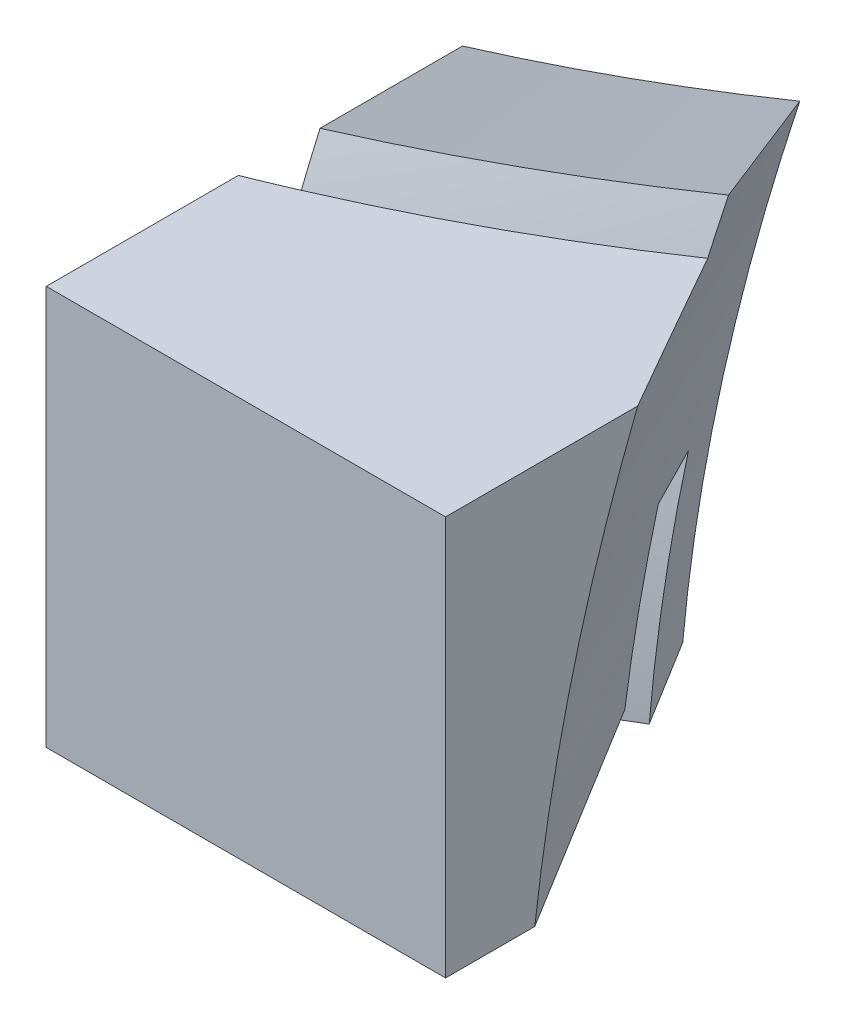
ISO-10303-21;
HEADER;
FILE_DESCRIPTION(('STEP AP214'),'2;1');
FILE_NAME('part.step','',(''),(''),'','','');
FILE_SCHEMA(('AUTOMOTIVE_DESIGN { 1 0 10303 214 1 1 1 1 }'));
ENDSEC;
DATA;
#1=APPLICATION_CONTEXT('core data for automotive mechanical design processes');
#2=APPLICATION_PROTOCOL_DEFINITION('international standard','automotive_design',2000,#1);
#3=PRODUCT_CONTEXT('',#1,'mechanical');
#4=PRODUCT('Part','Part','',(#3));
#5=PRODUCT_RELATED_PRODUCT_CATEGORY('part','',(#4));
#6=PRODUCT_DEFINITION_FORMATION('','',#4);
#7=PRODUCT_DEFINITION_CONTEXT('part definition',#1,'design');
#8=PRODUCT_DEFINITION('design','',#6,#7);
#9=PRODUCT_DEFINITION_SHAPE('','',#8);
#10=(LENGTH_UNIT() NAMED_UNIT(*) SI_UNIT(.MILLI.,.METRE.));
#11=(NAMED_UNIT(*) PLANE_ANGLE_UNIT() SI_UNIT($,.RADIAN.));
#12=(NAMED_UNIT(*) SI_UNIT($,.STERADIAN.) SOLID_ANGLE_UNIT());
#13=UNCERTAINTY_MEASURE_WITH_UNIT(LENGTH_MEASURE(1.E-05),#10,'distance_accuracy_value','');
#14=(GEOMETRIC_REPRESENTATION_CONTEXT(3) GLOBAL_UNCERTAINTY_ASSIGNED_CONTEXT((#13)) GLOBAL_UNIT_ASSIGNED_CONTEXT((#10,
#11,#12)) REPRESENTATION_CONTEXT('',''));
#15=CARTESIAN_POINT('',(0.,0.,0.));
#16=DIRECTION('',(0.,0.,1.));
#17=DIRECTION('',(1.,0.,0.));
#18=AXIS2_PLACEMENT_3D('',#15,#16,#17);
#19=CARTESIAN_POINT('',(19.4999999999999,32.5,0.));
#20=DIRECTION('',(-1.,0.,0.));
#21=DIRECTION('',(0.,0.,-1.));
#22=AXIS2_PLACEMENT_3D('',#19,#20,#21);
#23=PLANE('',#22);
#24=DIRECTION('',(0.,0.,-1.));
#25=VECTOR('',#24,1.);
#26=CARTESIAN_POINT('',(19.5,3.90000000000005,0.));
#27=LINE('',#26,#25);
#28=CARTESIAN_POINT('',(19.5,3.90000000000005,33.));
#29=VERTEX_POINT('',#28);
#30=CARTESIAN_POINT('',(19.5,3.90000000000005,31.2576390663146));
#31=VERTEX_POINT('',#30);
#32=EDGE_CURVE('E108',#29,#31,#27,.T.);
#33=ORIENTED_EDGE('',*,*,#32,.T.);
#34=CARTESIAN_POINT('',(19.5,0.,0.));
#35=DIRECTION('',(1.,0.,0.));
#36=DIRECTION('',(0.,0.,-1.));
#37=AXIS2_PLACEMENT_3D('',#34,#35,#36);
#38=CIRCLE('',#37,31.4999999999999);
#39=CARTESIAN_POINT('',(19.5,11.7000000000001,29.2465382566894));
#40=VERTEX_POINT('',#39);
#41=EDGE_CURVE('E45',#40,#31,#38,.T.);
#42=ORIENTED_EDGE('',*,*,#41,.F.);
#43=DIRECTION('',(0.,0.,-1.));
#44=VECTOR('',#43,1.);
#45=CARTESIAN_POINT('',(19.5,11.7000000000001,0.));
#46=LINE('',#45,#44);
#47=CARTESIAN_POINT('',(19.5,11.7,33.));
#48=VERTEX_POINT('',#47);
#49=EDGE_CURVE('E204',#48,#40,#46,.T.);
#50=ORIENTED_EDGE('',*,*,#49,.F.);
#51=DIRECTION('',(0.,1.,0.));
#52=VECTOR('',#51,1.);
#53=CARTESIAN_POINT('',(19.5000000000001,0.,33.));
#54=LINE('',#53,#52);
#55=EDGE_CURVE('E279',#29,#48,#54,.T.);
#56=ORIENTED_EDGE('',*,*,#55,.F.);
#57=EDGE_LOOP('',(#33,#42,#50,#56));
#58=FACE_BOUND('',#57,.T.);
#59=ADVANCED_FACE('F41',(#58),#23,.F.);
#60=CARTESIAN_POINT('',(13.5486364278669,0.,0.));
#61=DIRECTION('',(1.,0.,0.));
#62=DIRECTION('',(0.,0.,1.));
#63=AXIS2_PLACEMENT_3D('',#60,#61,#62);
#64=CONICAL_SURFACE('',#63,21.8862588450156,1.01648883059334);
#65=CARTESIAN_POINT('',(24.8011031541808,2.36043317420627,39.9937245464798));
#66=CARTESIAN_POINT('',(24.0512747995102,2.36043317420627,38.7803446115436));
#67=CARTESIAN_POINT('',(23.3015229149317,2.36043317420627,37.5669173991451));
#68=CARTESIAN_POINT('',(21.8022498437714,2.36043317420627,35.1399211144635));
#69=CARTESIAN_POINT('',(21.0527286571003,2.36043317420627,33.9263520422357));
#70=CARTESIAN_POINT('',(19.5539961645206,2.36043317420627,31.4990270418376));
#71=CARTESIAN_POINT('',(18.8047848577878,2.36043317420627,30.2852711141763));
#72=CARTESIAN_POINT('',(17.3068000141458,2.36043317420627,27.857488409065));
#73=CARTESIAN_POINT('',(16.5580264774201,2.36043317420627,26.6434616315017));
#74=CARTESIAN_POINT('',(15.0611285097934,2.36043317420627,24.2150008856621));
#75=CARTESIAN_POINT('',(14.3130040816391,2.36043317420627,23.0005669156926));
#76=CARTESIAN_POINT('',(12.8177734965329,2.36043317420627,20.5710735887598));
#77=CARTESIAN_POINT('',(12.0706673385902,2.36043317420627,19.3560142324065));
#78=CARTESIAN_POINT('',(10.951334575524,2.36043317420627,17.5326073416469));
#79=CARTESIAN_POINT('',(10.578443967322,2.36043317420627,16.9246674831929));
#80=CARTESIAN_POINT('',(9.83327851220865,2.36043317420627,15.7084108964553));
#81=CARTESIAN_POINT('',(9.46100366496131,2.36043317420627,15.1000941683775));
#82=CARTESIAN_POINT('',(8.71731898611144,2.36043317420627,13.8829290094769));
#83=CARTESIAN_POINT('',(8.34590915748662,2.36043317420627,13.2740805768336));
#84=CARTESIAN_POINT('',(7.78976255798648,2.36043317420627,12.3602178829223));
#85=CARTESIAN_POINT('',(7.60454154550687,2.36043317420627,12.0554983636333));
#86=CARTESIAN_POINT('',(7.23450991285466,2.36043317420627,11.4458100205214));
#87=CARTESIAN_POINT('',(7.04969929293434,2.36043317420627,11.1408411965452));
#88=CARTESIAN_POINT('',(6.86513776470055,2.36043317420627,10.8357215029914));
#89=B_SPLINE_CURVE_WITH_KNOTS('',3,(#65,#66,#67,#68,#69,#70,#71,#72,#73,#74,#75,#76,#77,#78,#79,
#80,#81,#82,#83,#84,#85,#86,#87,#88),.UNSPECIFIED.,.F.,.F.,(4,2,2,2,2,2,2,2,2,2,2,4),(0.,
4.27911218230018,8.55822270549597,12.8373217708467,17.1164226271796,21.3955415022916,
25.6746562108054,27.8142223728062,29.9537873670591,32.0933597156334,33.163147857496,
34.2329366568243),.UNSPECIFIED.);
#90=CARTESIAN_POINT('',(15.654054886332,2.36043317420627,25.176911630983));
#91=VERTEX_POINT('',#90);
#92=CARTESIAN_POINT('',(14.6013456570994,2.36043317420627,23.4683824983539));
#93=VERTEX_POINT('',#92);
#94=EDGE_CURVE('E154',#91,#93,#89,.T.);
#95=ORIENTED_EDGE('',*,*,#94,.T.);
#96=CARTESIAN_POINT('',(14.6013456570995,0.,0.));
#97=DIRECTION('',(-1.,0.,0.));
#98=DIRECTION('',(0.,-1.,0.));
#99=AXIS2_PLACEMENT_3D('',#96,#97,#98);
#100=CIRCLE('',#99,23.5867891383913);
#101=CARTESIAN_POINT('',(14.6013456570994,10.3743688599618,21.1827546040733));
#102=VERTEX_POINT('',#101);
#103=EDGE_CURVE('E217',#102,#93,#100,.F.);
#104=ORIENTED_EDGE('',*,*,#103,.F.);
#105=DIRECTION('',(0.526354614616296,0.373979018880187,0.763603636129074));
#106=VECTOR('',#105,1.);
#107=CARTESIAN_POINT('',(0.,0.,0.));
#108=LINE('',#107,#106);
#109=CARTESIAN_POINT('',(17.6869248733467,12.5666967239637,25.6591274592982));
#110=VERTEX_POINT('',#109);
#111=EDGE_CURVE('E292',#110,#102,#108,.F.);
#112=ORIENTED_EDGE('',*,*,#111,.F.);
#113=CARTESIAN_POINT('',(17.6869248733468,0.,0.));
#114=DIRECTION('',(-1.,0.,0.));
#115=DIRECTION('',(0.,-1.,0.));
#116=AXIS2_PLACEMENT_3D('',#113,#114,#115);
#117=CIRCLE('',#116,28.5711863338677);
#118=CARTESIAN_POINT('',(17.6869248733467,11.7000000000001,26.0657378281258));
#119=VERTEX_POINT('',#118);
#120=EDGE_CURVE('E296',#119,#110,#117,.T.);
#121=ORIENTED_EDGE('',*,*,#120,.F.);
#122=CARTESIAN_POINT('',(29.9831042332942,11.7000000000001,46.9998523165172));
#123=CARTESIAN_POINT('',(29.5695460419096,11.7000000000001,46.3114035057555));
#124=CARTESIAN_POINT('',(29.1563727624076,11.7000000000001,45.6227235286328));
#125=CARTESIAN_POINT('',(28.3309145968263,11.7000000000001,44.2448305512274));
#126=CARTESIAN_POINT('',(27.9186297115495,11.7000000000001,43.555617550464));
#127=CARTESIAN_POINT('',(26.6832428349779,11.7000000000001,41.4870015235794));
#128=CARTESIAN_POINT('',(25.8616526236678,11.7000000000001,40.1066946636882));
#129=CARTESIAN_POINT('',(24.2230959746683,11.7000000000001,37.3416252164109));
#130=CARTESIAN_POINT('',(23.4061344741696,11.7000000000001,35.9568597018244));
#131=CARTESIAN_POINT('',(21.7796223492399,11.7000000000001,33.1830492762636));
#132=CARTESIAN_POINT('',(20.970071426122,11.7000000000001,31.7940045408084));
#133=CARTESIAN_POINT('',(19.7705932500849,11.7000000000001,29.7178208854183));
#134=CARTESIAN_POINT('',(19.3766538702403,11.7000000000001,29.0330001316483));
#135=CARTESIAN_POINT('',(18.5918894504467,11.7000000000001,27.6615773365093));
#136=CARTESIAN_POINT('',(18.2010644029119,11.7000000000001,26.9749752994846));
#137=CARTESIAN_POINT('',(17.423168342795,11.7000000000001,25.5995290510725));
#138=CARTESIAN_POINT('',(17.036097821589,11.7000000000001,24.9106845615479));
#139=CARTESIAN_POINT('',(16.2666803040386,11.7000000000001,23.5303641361797));
#140=CARTESIAN_POINT('',(15.8843332831974,11.7000000000001,22.8388882140075));
#141=CARTESIAN_POINT('',(15.1254733333848,11.7000000000001,21.4524772962229));
#142=CARTESIAN_POINT('',(14.7489621260672,11.7000000000001,20.7575413568386));
#143=CARTESIAN_POINT('',(14.0035422153921,11.7000000000001,19.3635718196275));
#144=CARTESIAN_POINT('',(13.6346337030667,11.7000000000001,18.6645381194022));
#145=CARTESIAN_POINT('',(12.9068241377435,11.7000000000001,17.2614510623169));
#146=CARTESIAN_POINT('',(12.5479210327491,11.7000000000001,16.5573987724639));
#147=CARTESIAN_POINT('',(11.8433270003428,11.7000000000001,15.1427313714644));
#148=CARTESIAN_POINT('',(11.497635196273,11.7000000000001,14.4321166996746));
#149=CARTESIAN_POINT('',(10.9364574878759,11.7000000000001,13.240600979307));
#150=CARTESIAN_POINT('',(10.7159690889732,11.7000000000001,12.7620597933423));
#151=CARTESIAN_POINT('',(10.2849806158187,11.7000000000001,11.8004978032896));
#152=CARTESIAN_POINT('',(10.0744802539218,11.7000000000001,11.3174771286857));
#153=CARTESIAN_POINT('',(9.66645541430141,11.7000000000001,10.3472711456755));
#154=CARTESIAN_POINT('',(9.4689021222929,11.7000000000001,9.86009801543928));
#155=CARTESIAN_POINT('',(9.08946560082895,11.7000000000001,8.87955373046023));
#156=CARTESIAN_POINT('',(8.90758483272758,11.7000000000001,8.3861816160635));
#157=CARTESIAN_POINT('',(8.5624843162843,11.7000000000001,7.38905623057931));
#158=CARTESIAN_POINT('',(8.39940314340287,11.7000000000001,6.88525462559466));
#159=CARTESIAN_POINT('',(8.09868484115985,11.7000000000001,5.87024913974239));
#160=CARTESIAN_POINT('',(7.96103480095306,11.7000000000001,5.35904915780938));
#161=CARTESIAN_POINT('',(7.77767829893197,11.7000000000001,4.58476199325067));
#162=CARTESIAN_POINT('',(7.720241995675,11.7000000000001,4.32443264170045));
#163=CARTESIAN_POINT('',(7.61414186909903,11.7000000000001,3.80199727296307));
#164=CARTESIAN_POINT('',(7.5654774514676,11.7000000000001,3.53989137738966));
#165=CARTESIAN_POINT('',(7.47762859472269,11.7000000000001,3.01369854516661));
#166=CARTESIAN_POINT('',(7.43845788058526,11.7000000000001,2.74960930277732));
#167=CARTESIAN_POINT('',(7.37033995165896,11.7000000000001,2.22004865762173));
#168=CARTESIAN_POINT('',(7.34139544112448,11.7000000000001,1.95457690806531));
#169=CARTESIAN_POINT('',(7.31790114012981,11.7000000000001,1.68859662969376));
#170=B_SPLINE_CURVE_WITH_KNOTS('',3,(#122,#123,#124,#125,#126,#127,#128,#129,#130,#131,#132,
#133,#134,#135,#136,#137,#138,#139,#140,#141,#142,#143,#144,#145,#146,#147,#148,#149,#150,#151,
#152,#153,#154,#155,#156,#157,#158,#159,#160,#161,#162,#163,#164,#165,#166,#167,#168,#169),
.UNSPECIFIED.,.F.,.F.,(4,2,2,2,2,2,2,2,2,2,2,2,2,2,2,2,2,2,2,2,2,2,2,4),(0.,2.40934177011957,
4.81868571602445,9.63762980352724,14.4609978331241,19.2841705909017,21.6542928680232,
24.0244093702654,26.3948319875908,28.7652423064302,31.1363391094846,33.5074954184083,
35.8781617978656,38.2486705936817,39.8292635557093,41.4098109706272,42.9867121606657,
44.5638605517928,46.1519772751732,47.7392855165716,48.5389310863669,49.3385224582279,
50.1392629888806,50.9402151120507),.UNSPECIFIED.);
#171=EDGE_CURVE('E197',#40,#119,#170,.T.);
#172=ORIENTED_EDGE('',*,*,#171,.F.);
#173=ORIENTED_EDGE('',*,*,#41,.T.);
#174=CARTESIAN_POINT('',(26.981632298887,3.90000000000005,43.410879280691));
#175=CARTESIAN_POINT('',(26.1079588700875,3.90000000000005,41.9938382880044));
#176=CARTESIAN_POINT('',(25.2345013435676,3.90000000000005,40.576663996944));
#177=CARTESIAN_POINT('',(23.4882737650834,3.90000000000005,37.7419020872876));
#178=CARTESIAN_POINT('',(22.6155037095799,3.90000000000005,36.3243144708717));
#179=CARTESIAN_POINT('',(20.8709210600193,3.90000000000005,33.4886024943368));
#180=CARTESIAN_POINT('',(19.9991084409297,3.90000000000005,32.0704781496204));
#181=CARTESIAN_POINT('',(18.256847910122,3.90000000000005,29.2333806526732));
#182=CARTESIAN_POINT('',(17.3864000056548,3.90000000000005,27.8144074959875));
#183=CARTESIAN_POINT('',(16.0823163404525,3.90000000000005,25.6849295437214));
#184=CARTESIAN_POINT('',(15.647876369202,3.90000000000005,24.974917283884));
#185=CARTESIAN_POINT('',(14.7796918509744,3.90000000000005,23.5544684540386));
#186=CARTESIAN_POINT('',(14.3459473034086,3.90000000000005,22.8440318843905));
#187=CARTESIAN_POINT('',(13.4793719578897,3.90000000000005,21.422614494192));
#188=CARTESIAN_POINT('',(13.0465411478755,3.90000000000005,20.7116336809963));
#189=CARTESIAN_POINT('',(12.182098353347,3.90000000000005,19.2889280552639));
#190=CARTESIAN_POINT('',(11.7504863726865,3.90000000000005,18.5772032403845));
#191=CARTESIAN_POINT('',(10.8889370785867,3.90000000000005,17.1526941527402));
#192=CARTESIAN_POINT('',(10.4589998457121,3.90000000000005,16.4399098312314));
#193=CARTESIAN_POINT('',(9.60156393048008,3.90000000000005,15.0128821247618));
#194=CARTESIAN_POINT('',(9.17406522692966,3.90000000000005,14.2986387525548));
#195=CARTESIAN_POINT('',(8.53560197710837,3.90000000000005,13.2255923954237));
#196=CARTESIAN_POINT('',(8.32323983628905,3.90000000000005,12.8676212298307));
#197=CARTESIAN_POINT('',(7.8997080584052,3.90000000000005,12.1509755139606));
#198=CARTESIAN_POINT('',(7.68853841724979,3.90000000000005,11.792300966102));
#199=CARTESIAN_POINT('',(7.26770931672158,3.90000000000005,11.0740513729932));
#200=CARTESIAN_POINT('',(7.05804990234182,3.90000000000005,10.714476301341));
#201=CARTESIAN_POINT('',(6.64077224921907,3.90000000000005,9.99413869080626));
#202=CARTESIAN_POINT('',(6.43315403474698,3.90000000000005,9.63337613787198));
#203=CARTESIAN_POINT('',(6.22682125004522,3.90000000000005,9.27187532338227));
#204=B_SPLINE_CURVE_WITH_KNOTS('',3,(#174,#175,#176,#177,#178,#179,#180,#181,#182,#183,#184,
#185,#186,#187,#188,#189,#190,#191,#192,#193,#194,#195,#196,#197,#198,#199,#200,#201,#202,#203),
.UNSPECIFIED.,.F.,.F.,(4,2,2,2,2,2,2,2,2,2,2,2,2,2,4),(0.,4.9941762265666,9.98832657213658,
14.9823430770962,19.9763860263468,22.4735239949208,24.9706598486392,27.4677625324719,
29.9648731031794,32.4621023511511,34.9593098629344,36.2079750776802,37.4566360062806,
38.7053339826941,39.9540467888454),.UNSPECIFIED.);
#205=CARTESIAN_POINT('',(16.7067641155646,3.90000000000005,26.7045695113568));
#206=VERTEX_POINT('',#205);
#207=EDGE_CURVE('E211',#31,#206,#204,.T.);
#208=ORIENTED_EDGE('',*,*,#207,.T.);
#209=CARTESIAN_POINT('',(16.7067641155646,0.,0.));
#210=DIRECTION('',(-1.,0.,0.));
#211=DIRECTION('',(0.,-1.,0.));
#212=AXIS2_PLACEMENT_3D('',#209,#210,#211);
#213=CIRCLE('',#212,26.9878497251428);
#214=CARTESIAN_POINT('',(16.7067641155646,7.04704306544776,26.0515492211234));
#215=VERTEX_POINT('',#214);
#216=EDGE_CURVE('E93',#206,#215,#213,.T.);
#217=ORIENTED_EDGE('',*,*,#216,.T.);
#218=DIRECTION('',(0.526354614616296,0.222020470944612,0.820766550337953));
#219=VECTOR('',#218,1.);
#220=CARTESIAN_POINT('',(0.,0.,0.));
#221=LINE('',#220,#219);
#222=CARTESIAN_POINT('',(15.654054886332,6.60300212355853,24.4100161204475));
#223=VERTEX_POINT('',#222);
#224=EDGE_CURVE('E115',#215,#223,#221,.F.);
#225=ORIENTED_EDGE('',*,*,#224,.T.);
#226=CARTESIAN_POINT('',(15.654054886332,0.,0.));
#227=DIRECTION('',(-1.,0.,0.));
#228=DIRECTION('',(0.,-1.,0.));
#229=AXIS2_PLACEMENT_3D('',#226,#227,#228);
#230=CIRCLE('',#229,25.287319431767);
#231=EDGE_CURVE('E311',#223,#91,#230,.F.);
#232=ORIENTED_EDGE('',*,*,#231,.T.);
#233=EDGE_LOOP('',(#95,#104,#112,#121,#172,#173,#208,#217,#225,#232));
#234=FACE_BOUND('',#233,.T.);
#235=ADVANCED_FACE('F177',(#234),#64,.F.);
#236=CARTESIAN_POINT('',(32.5,11.7000000000001,0.));
#237=DIRECTION('',(0.,-1.,0.));
#238=DIRECTION('',(0.,0.,-1.));
#239=AXIS2_PLACEMENT_3D('',#236,#237,#238);
#240=PLANE('',#239);
#241=ORIENTED_EDGE('',*,*,#49,.T.);
#242=ORIENTED_EDGE('',*,*,#171,.T.);
#243=CARTESIAN_POINT('',(0.,11.7000000000001,0.));
#244=DIRECTION('',(0.,-1.,0.));
#245=DIRECTION('',(0.,0.,-1.));
#246=AXIS2_PLACEMENT_3D('',#243,#244,#245);
#247=CIRCLE('',#246,31.5);
#248=CARTESIAN_POINT('',(12.5666967239636,11.7000000000001,28.8847387637126));
#249=VERTEX_POINT('',#248);
#250=EDGE_CURVE('E222',#119,#249,#247,.T.);
#251=ORIENTED_EDGE('',*,*,#250,.T.);
#252=CARTESIAN_POINT('',(11.7,11.7000000000001,29.2465382566895));
#253=VERTEX_POINT('',#252);
#254=EDGE_CURVE('E224',#249,#253,#247,.T.);
#255=ORIENTED_EDGE('',*,*,#254,.T.);
#256=DIRECTION('',(0.,0.,-1.));
#257=VECTOR('',#256,1.);
#258=CARTESIAN_POINT('',(11.7,11.7000000000001,0.));
#259=LINE('',#258,#257);
#260=CARTESIAN_POINT('',(11.7,11.7000000000001,33.));
#261=VERTEX_POINT('',#260);
#262=EDGE_CURVE('E283',#261,#253,#259,.T.);
#263=ORIENTED_EDGE('',*,*,#262,.F.);
#264=DIRECTION('',(-1.,0.,0.));
#265=VECTOR('',#264,1.);
#266=CARTESIAN_POINT('',(0.,11.7000000000001,33.));
#267=LINE('',#266,#265);
#268=EDGE_CURVE('E277',#48,#261,#267,.T.);
#269=ORIENTED_EDGE('',*,*,#268,.F.);
#270=EDGE_LOOP('',(#241,#242,#251,#255,#263,#269));
#271=FACE_BOUND('',#270,.T.);
#272=ADVANCED_FACE('F183',(#271),#240,.F.);
#273=CARTESIAN_POINT('',(0.,0.,0.));
#274=DIRECTION('',(0.,-1.,0.));
#275=DIRECTION('',(1.,0.,0.));
#276=AXIS2_PLACEMENT_3D('',#273,#274,#275);
#277=SPHERICAL_SURFACE('',#276,33.6026784646701);
#278=ORIENTED_EDGE('',*,*,#250,.F.);
#279=ORIENTED_EDGE('',*,*,#120,.T.);
#280=CARTESIAN_POINT('',(0.,12.5666967239637,0.));
#281=DIRECTION('',(0.,-1.,0.));
#282=DIRECTION('',(0.,0.,-1.));
#283=AXIS2_PLACEMENT_3D('',#280,#281,#282);
#284=CIRCLE('',#283,31.1643728229516);
#285=CARTESIAN_POINT('',(12.5666967239637,12.5666967239637,28.5183496523877));
#286=VERTEX_POINT('',#285);
#287=EDGE_CURVE('E220',#110,#286,#284,.T.);
#288=ORIENTED_EDGE('',*,*,#287,.T.);
#289=CARTESIAN_POINT('',(12.5666967239637,0.,0.));
#290=DIRECTION('',(-1.,0.,0.));
#291=DIRECTION('',(0.,-1.,0.));
#292=AXIS2_PLACEMENT_3D('',#289,#290,#291);
#293=CIRCLE('',#292,31.1643728229516);
#294=EDGE_CURVE('E60',#249,#286,#293,.T.);
#295=ORIENTED_EDGE('',*,*,#294,.F.);
#296=EDGE_LOOP('',(#278,#279,#288,#295));
#297=FACE_BOUND('',#296,.T.);
#298=ADVANCED_FACE('F193',(#297),#277,.T.);
#299=CARTESIAN_POINT('',(0.,10.3743688599618,0.));
#300=DIRECTION('',(0.,1.,0.));
#301=DIRECTION('',(0.,0.,1.));
#302=AXIS2_PLACEMENT_3D('',#299,#300,#301);
#303=CONICAL_SURFACE('',#302,25.7275802907014,1.18750065982306);
#304=ORIENTED_EDGE('',*,*,#287,.F.);
#305=ORIENTED_EDGE('',*,*,#111,.T.);
#306=CARTESIAN_POINT('',(0.,10.3743688599618,0.));
#307=DIRECTION('',(0.,-1.,0.));
#308=DIRECTION('',(0.,0.,-1.));
#309=AXIS2_PLACEMENT_3D('',#306,#307,#308);
#310=CIRCLE('',#309,25.7275802907014);
#311=CARTESIAN_POINT('',(10.3743688599618,10.3743688599618,23.543170100306));
#312=VERTEX_POINT('',#311);
#313=EDGE_CURVE('E205',#102,#312,#310,.T.);
#314=ORIENTED_EDGE('',*,*,#313,.T.);
#315=DIRECTION('',(0.373979018880186,0.373979018880187,0.848692751751083));
#316=VECTOR('',#315,1.);
#317=CARTESIAN_POINT('',(0.,0.,0.));
#318=LINE('',#317,#316);
#319=EDGE_CURVE('E293',#286,#312,#318,.F.);
#320=ORIENTED_EDGE('',*,*,#319,.F.);
#321=EDGE_LOOP('',(#304,#305,#314,#320));
#322=FACE_BOUND('',#321,.T.);
#323=ADVANCED_FACE('F188',(#322),#303,.F.);
#324=CARTESIAN_POINT('',(0.,0.,0.));
#325=DIRECTION('',(0.,-1.,0.));
#326=DIRECTION('',(1.,0.,0.));
#327=AXIS2_PLACEMENT_3D('',#324,#325,#326);
#328=SPHERICAL_SURFACE('',#327,27.7405103928719);
#329=ORIENTED_EDGE('',*,*,#313,.F.);
#330=ORIENTED_EDGE('',*,*,#103,.T.);
#331=CARTESIAN_POINT('',(0.,2.36043317420627,0.));
#332=DIRECTION('',(0.,-1.,0.));
#333=DIRECTION('',(0.,0.,-1.));
#334=AXIS2_PLACEMENT_3D('',#331,#332,#333);
#335=CIRCLE('',#334,27.6399036193533);
#336=CARTESIAN_POINT('',(10.3743688599618,2.36043317420627,25.6190699059234));
#337=VERTEX_POINT('',#336);
#338=EDGE_CURVE('E289',#93,#337,#335,.T.);
#339=ORIENTED_EDGE('',*,*,#338,.T.);
#340=CARTESIAN_POINT('',(10.3743688599618,0.,0.));
#341=DIRECTION('',(1.,0.,0.));
#342=DIRECTION('',(0.,0.,-1.));
#343=AXIS2_PLACEMENT_3D('',#340,#341,#342);
#344=CIRCLE('',#343,25.7275802907014);
#345=EDGE_CURVE('E97',#312,#337,#344,.T.);
#346=ORIENTED_EDGE('',*,*,#345,.F.);
#347=EDGE_LOOP('',(#329,#330,#339,#346));
#348=FACE_BOUND('',#347,.T.);
#349=ADVANCED_FACE('F195',(#348),#328,.F.);
#350=CARTESIAN_POINT('',(32.5000000000001,3.90000000000005,0.));
#351=DIRECTION('',(0.,-1.,0.));
#352=DIRECTION('',(0.,0.,-1.));
#353=AXIS2_PLACEMENT_3D('',#350,#351,#352);
#354=PLANE('',#353);
#355=ORIENTED_EDGE('',*,*,#32,.F.);
#356=DIRECTION('',(-1.,0.,0.));
#357=VECTOR('',#356,1.);
#358=CARTESIAN_POINT('',(0.,3.90000000000005,33.));
#359=LINE('',#358,#357);
#360=CARTESIAN_POINT('',(11.7,3.90000000000005,33.));
#361=VERTEX_POINT('',#360);
#362=EDGE_CURVE('E153',#29,#361,#359,.T.);
#363=ORIENTED_EDGE('',*,*,#362,.T.);
#364=DIRECTION('',(0.,0.,-1.));
#365=VECTOR('',#364,1.);
#366=CARTESIAN_POINT('',(11.7,3.90000000000005,0.));
#367=LINE('',#366,#365);
#368=CARTESIAN_POINT('',(11.7,3.90000000000005,31.2576390663147));
#369=VERTEX_POINT('',#368);
#370=EDGE_CURVE('E119',#361,#369,#367,.T.);
#371=ORIENTED_EDGE('',*,*,#370,.T.);
#372=CARTESIAN_POINT('',(0.,3.90000000000005,0.));
#373=DIRECTION('',(0.,-1.,0.));
#374=DIRECTION('',(0.,0.,-1.));
#375=AXIS2_PLACEMENT_3D('',#372,#373,#374);
#376=CIRCLE('',#375,33.3755898824276);
#377=CARTESIAN_POINT('',(12.5666967239637,3.90000000000005,30.9193811944535));
#378=VERTEX_POINT('',#377);
#379=EDGE_CURVE('E107',#369,#378,#376,.F.);
#380=ORIENTED_EDGE('',*,*,#379,.T.);
#381=CARTESIAN_POINT('',(15.8428159993568,3.90000000000005,39.0948333737115));
#382=CARTESIAN_POINT('',(15.4506243000185,3.90000000000005,38.1173902760603));
#383=CARTESIAN_POINT('',(15.0585491859474,3.90000000000005,37.1399003678757));
#384=CARTESIAN_POINT('',(14.2747158007469,3.90000000000005,35.1847934857351));
#385=CARTESIAN_POINT('',(13.8829575296297,3.90000000000005,34.2071765117744));
#386=CARTESIAN_POINT('',(13.0998428568644,3.90000000000005,32.2517854343566));
#387=CARTESIAN_POINT('',(12.7084864538621,3.90000000000005,31.2740113314421));
#388=CARTESIAN_POINT('',(11.9263012988237,3.90000000000005,29.3182517798619));
#389=CARTESIAN_POINT('',(11.5354725469228,3.90000000000005,28.3402663311421));
#390=CARTESIAN_POINT('',(10.75452449958,3.90000000000005,26.3840077255101));
#391=CARTESIAN_POINT('',(10.3644052069063,3.90000000000005,25.4057345674925));
#392=CARTESIAN_POINT('',(9.58515860199132,3.90000000000005,23.448793878639));
#393=CARTESIAN_POINT('',(9.19603128912186,3.90000000000005,22.4701263480533));
#394=CARTESIAN_POINT('',(8.4192088609626,3.90000000000005,20.5122185395305));
#395=CARTESIAN_POINT('',(8.03151375076951,3.90000000000005,19.5329782595696));
#396=CARTESIAN_POINT('',(7.45162310767204,3.90000000000005,18.063464551947));
#397=CARTESIAN_POINT('',(7.25860136101071,3.90000000000005,17.5735172511564));
#398=CARTESIAN_POINT('',(6.87327397443436,3.90000000000005,16.5933407559649));
#399=CARTESIAN_POINT('',(6.68096833505589,3.90000000000005,16.1031115613531));
#400=CARTESIAN_POINT('',(6.48910354133777,3.90000000000005,15.612709549546));
#401=B_SPLINE_CURVE_WITH_KNOTS('',3,(#381,#382,#383,#384,#385,#386,#387,#388,#389,#390,#391,
#392,#393,#394,#395,#396,#397,#398,#399,#400),.UNSPECIFIED.,.F.,.F.,(4,2,2,2,2,2,2,2,2,4),(0.,
3.15957026715415,6.31914065585586,9.47870036144744,12.6382608762607,15.7978336926141,
18.9574045074345,22.1169865552483,23.6967809107883,25.2765764497666),.UNSPECIFIED.);
#402=CARTESIAN_POINT('',(11.8702849354826,3.90000000000005,29.1778398026732));
#403=VERTEX_POINT('',#402);
#404=EDGE_CURVE('E102',#378,#403,#401,.T.);
#405=ORIENTED_EDGE('',*,*,#404,.T.);
#406=CARTESIAN_POINT('',(0.,3.90000000000005,0.));
#407=DIRECTION('',(0.,-1.,0.));
#408=DIRECTION('',(0.,0.,-1.));
#409=AXIS2_PLACEMENT_3D('',#406,#407,#408);
#410=CIRCLE('',#409,31.5000000000001);
#411=EDGE_CURVE('E84',#206,#403,#410,.T.);
#412=ORIENTED_EDGE('',*,*,#411,.F.);
#413=ORIENTED_EDGE('',*,*,#207,.F.);
#414=EDGE_LOOP('',(#355,#363,#371,#380,#405,#412,#413));
#415=FACE_BOUND('',#414,.T.);
#416=ADVANCED_FACE('F104',(#415),#354,.T.);
#417=CARTESIAN_POINT('',(11.6999999999999,32.5000000000001,0.));
#418=DIRECTION('',(-1.,0.,0.));
#419=DIRECTION('',(0.,0.,-1.));
#420=AXIS2_PLACEMENT_3D('',#417,#418,#419);
#421=PLANE('',#420);
#422=ORIENTED_EDGE('',*,*,#370,.F.);
#423=DIRECTION('',(0.,1.,0.));
#424=VECTOR('',#423,1.);
#425=CARTESIAN_POINT('',(11.7000000000001,0.,33.));
#426=LINE('',#425,#424);
#427=EDGE_CURVE('E285',#361,#261,#426,.T.);
#428=ORIENTED_EDGE('',*,*,#427,.T.);
#429=ORIENTED_EDGE('',*,*,#262,.T.);
#430=CARTESIAN_POINT('',(11.7000000000001,0.,0.));
#431=DIRECTION('',(1.,0.,0.));
#432=DIRECTION('',(0.,0.,-1.));
#433=AXIS2_PLACEMENT_3D('',#430,#431,#432);
#434=CIRCLE('',#433,31.5);
#435=EDGE_CURVE('E11',#253,#369,#434,.T.);
#436=ORIENTED_EDGE('',*,*,#435,.T.);
#437=EDGE_LOOP('',(#422,#428,#429,#436));
#438=FACE_BOUND('',#437,.T.);
#439=ADVANCED_FACE('F173',(#438),#421,.T.);
#440=CARTESIAN_POINT('',(0.,0.,0.));
#441=DIRECTION('',(-1.,0.,0.));
#442=DIRECTION('',(0.,1.,0.));
#443=AXIS2_PLACEMENT_3D('',#440,#441,#442);
#444=SPHERICAL_SURFACE('',#443,33.6026784646701);
#445=ORIENTED_EDGE('',*,*,#379,.F.);
#446=ORIENTED_EDGE('',*,*,#435,.F.);
#447=ORIENTED_EDGE('',*,*,#254,.F.);
#448=CARTESIAN_POINT('',(12.5666967239637,0.,0.));
#449=DIRECTION('',(1.,0.,0.));
#450=DIRECTION('',(0.,0.,-1.));
#451=AXIS2_PLACEMENT_3D('',#448,#449,#450);
#452=CIRCLE('',#451,31.1643728229516);
#453=EDGE_CURVE('E51',#249,#378,#452,.T.);
#454=ORIENTED_EDGE('',*,*,#453,.T.);
#455=EDGE_LOOP('',(#445,#446,#447,#454));
#456=FACE_BOUND('',#455,.T.);
#457=ADVANCED_FACE('F139',(#456),#444,.F.);
#458=CARTESIAN_POINT('',(10.3743688599618,0.,0.));
#459=DIRECTION('',(1.,0.,0.));
#460=DIRECTION('',(0.,0.,1.));
#461=AXIS2_PLACEMENT_3D('',#458,#459,#460);
#462=CONICAL_SURFACE('',#461,25.7275802907014,1.18750065982306);
#463=CARTESIAN_POINT('',(14.6009778131257,2.36043317420627,36.132203640911));
#464=CARTESIAN_POINT('',(13.9616090247387,2.36043317420627,34.5431705104168));
#465=CARTESIAN_POINT('',(13.3223490618145,2.36043317420627,32.9540934847873));
#466=CARTESIAN_POINT('',(12.0443112360116,2.36043317420627,29.7757461717207));
#467=CARTESIAN_POINT('',(11.4055333729816,2.36043317420627,28.1864758843445));
#468=CARTESIAN_POINT('',(10.4479260833091,2.36043317420627,25.8023453920018));
#469=CARTESIAN_POINT('',(10.1288168512602,2.36043317420627,25.0075975856167));
#470=CARTESIAN_POINT('',(9.49085284622169,2.36043317420627,23.4179998864793));
#471=CARTESIAN_POINT('',(9.17199807322086,2.36043317420627,22.6231499937315));
#472=CARTESIAN_POINT('',(8.53462700120133,2.36043317420627,21.0333141768994));
#473=CARTESIAN_POINT('',(8.21611070229252,2.36043317420627,20.238328252771));
#474=CARTESIAN_POINT('',(7.57957409611464,2.36043317420627,18.6481577395725));
#475=CARTESIAN_POINT('',(7.26155378892149,2.36043317420627,17.8529731504719));
#476=CARTESIAN_POINT('',(6.94386023337683,2.36043317420627,17.0576579047928));
#477=B_SPLINE_CURVE_WITH_KNOTS('',3,(#463,#464,#465,#466,#467,#468,#469,#470,#471,#472,#473,
#474,#475,#476),.UNSPECIFIED.,.F.,.F.,(4,2,2,2,2,2,4),(0.,5.13851829557567,10.2770349800929,
12.846294176063,15.415553258566,17.9848131748197,20.5540734842582),.UNSPECIFIED.);
#478=CARTESIAN_POINT('',(11.1223268977222,2.36043317420627,27.4812692217596));
#479=VERTEX_POINT('',#478);
#480=EDGE_CURVE('E144',#479,#337,#477,.T.);
#481=ORIENTED_EDGE('',*,*,#480,.F.);
#482=CARTESIAN_POINT('',(11.1223268977222,0.,0.));
#483=DIRECTION('',(-1.,0.,0.));
#484=DIRECTION('',(0.,-1.,0.));
#485=AXIS2_PLACEMENT_3D('',#482,#483,#484);
#486=CIRCLE('',#485,27.5824546189915);
#487=CARTESIAN_POINT('',(11.1223268977222,6.60300212355853,26.7804437185982));
#488=VERTEX_POINT('',#487);
#489=EDGE_CURVE('E309',#488,#479,#486,.F.);
#490=ORIENTED_EDGE('',*,*,#489,.F.);
#491=DIRECTION('',(0.373979018880187,0.222020470944612,0.900470212677213));
#492=VECTOR('',#491,1.);
#493=CARTESIAN_POINT('',(0.,0.,0.));
#494=LINE('',#493,#492);
#495=CARTESIAN_POINT('',(11.8702849354826,7.04704306544776,28.5813841439526));
#496=VERTEX_POINT('',#495);
#497=EDGE_CURVE('E114',#496,#488,#494,.F.);
#498=ORIENTED_EDGE('',*,*,#497,.F.);
#499=CARTESIAN_POINT('',(11.8702849354826,0.,0.));
#500=DIRECTION('',(-1.,0.,0.));
#501=DIRECTION('',(0.,-1.,0.));
#502=AXIS2_PLACEMENT_3D('',#499,#500,#501);
#503=CIRCLE('',#502,29.4373289472816);
#504=EDGE_CURVE('E89',#403,#496,#503,.T.);
#505=ORIENTED_EDGE('',*,*,#504,.F.);
#506=ORIENTED_EDGE('',*,*,#404,.F.);
#507=ORIENTED_EDGE('',*,*,#453,.F.);
#508=ORIENTED_EDGE('',*,*,#294,.T.);
#509=ORIENTED_EDGE('',*,*,#319,.T.);
#510=ORIENTED_EDGE('',*,*,#345,.T.);
#511=EDGE_LOOP('',(#481,#490,#498,#505,#506,#507,#508,#509,#510));
#512=FACE_BOUND('',#511,.T.);
#513=ADVANCED_FACE('F111',(#512),#462,.T.);
#514=CARTESIAN_POINT('',(0.,0.,0.));
#515=DIRECTION('',(0.,-1.,0.));
#516=DIRECTION('',(1.,0.,0.));
#517=AXIS2_PLACEMENT_3D('',#514,#515,#516);
#518=SPHERICAL_SURFACE('',#517,31.7405103928719);
#519=ORIENTED_EDGE('',*,*,#411,.T.);
#520=ORIENTED_EDGE('',*,*,#504,.T.);
#521=CARTESIAN_POINT('',(0.,7.04704306544776,0.));
#522=DIRECTION('',(0.,-1.,0.));
#523=DIRECTION('',(0.,0.,-1.));
#524=AXIS2_PLACEMENT_3D('',#521,#522,#523);
#525=CIRCLE('',#524,30.9483308763773);
#526=EDGE_CURVE('E98',#215,#496,#525,.T.);
#527=ORIENTED_EDGE('',*,*,#526,.F.);
#528=ORIENTED_EDGE('',*,*,#216,.F.);
#529=EDGE_LOOP('',(#519,#520,#527,#528));
#530=FACE_BOUND('',#529,.T.);
#531=ADVANCED_FACE('F86',(#530),#518,.F.);
#532=CARTESIAN_POINT('',(0.,6.60300212355853,0.));
#533=DIRECTION('',(0.,1.,0.));
#534=DIRECTION('',(0.,0.,1.));
#535=AXIS2_PLACEMENT_3D('',#532,#533,#534);
#536=CONICAL_SURFACE('',#535,28.9982468674367,1.34691015484274);
#537=ORIENTED_EDGE('',*,*,#526,.T.);
#538=ORIENTED_EDGE('',*,*,#497,.T.);
#539=CARTESIAN_POINT('',(0.,6.60300212355853,0.));
#540=DIRECTION('',(0.,-1.,0.));
#541=DIRECTION('',(0.,0.,-1.));
#542=AXIS2_PLACEMENT_3D('',#539,#540,#541);
#543=CIRCLE('',#542,28.9982468674367);
#544=EDGE_CURVE('E303',#223,#488,#543,.T.);
#545=ORIENTED_EDGE('',*,*,#544,.F.);
#546=ORIENTED_EDGE('',*,*,#224,.F.);
#547=EDGE_LOOP('',(#537,#538,#545,#546));
#548=FACE_BOUND('',#547,.T.);
#549=ADVANCED_FACE('F164',(#548),#536,.T.);
#550=CARTESIAN_POINT('',(27.6399036193533,2.36043317420627,0.));
#551=DIRECTION('',(0.,-1.,0.));
#552=DIRECTION('',(0.,0.,-1.));
#553=AXIS2_PLACEMENT_3D('',#550,#551,#552);
#554=PLANE('',#553);
#555=CARTESIAN_POINT('',(0.,2.36043317420627,0.));
#556=DIRECTION('',(0.,-1.,0.));
#557=DIRECTION('',(0.,0.,-1.));
#558=AXIS2_PLACEMENT_3D('',#555,#556,#557);
#559=CIRCLE('',#558,29.6466914453978);
#560=EDGE_CURVE('E281',#91,#479,#559,.T.);
#561=ORIENTED_EDGE('',*,*,#560,.T.);
#562=ORIENTED_EDGE('',*,*,#480,.T.);
#563=ORIENTED_EDGE('',*,*,#338,.F.);
#564=ORIENTED_EDGE('',*,*,#94,.F.);
#565=EDGE_LOOP('',(#561,#562,#563,#564));
#566=FACE_BOUND('',#565,.T.);
#567=ADVANCED_FACE('F140',(#566),#554,.T.);
#568=CARTESIAN_POINT('',(0.,0.,0.));
#569=DIRECTION('',(0.,-1.,0.));
#570=DIRECTION('',(1.,0.,0.));
#571=AXIS2_PLACEMENT_3D('',#568,#569,#570);
#572=SPHERICAL_SURFACE('',#571,29.7405103928719);
#573=ORIENTED_EDGE('',*,*,#544,.T.);
#574=ORIENTED_EDGE('',*,*,#489,.T.);
#575=ORIENTED_EDGE('',*,*,#560,.F.);
#576=ORIENTED_EDGE('',*,*,#231,.F.);
#577=EDGE_LOOP('',(#573,#574,#575,#576));
#578=FACE_BOUND('',#577,.T.);
#579=ADVANCED_FACE('F163',(#578),#572,.T.);
#580=CARTESIAN_POINT('',(0.,0.,33.));
#581=DIRECTION('',(0.,0.,-1.));
#582=DIRECTION('',(-1.,0.,0.));
#583=AXIS2_PLACEMENT_3D('',#580,#581,#582);
#584=PLANE('',#583);
#585=ORIENTED_EDGE('',*,*,#427,.F.);
#586=ORIENTED_EDGE('',*,*,#362,.F.);
#587=ORIENTED_EDGE('',*,*,#55,.T.);
#588=ORIENTED_EDGE('',*,*,#268,.T.);
#589=EDGE_LOOP('',(#585,#586,#587,#588));
#590=FACE_BOUND('',#589,.T.);
#591=ADVANCED_FACE('F43',(#590),#584,.F.);
#592=CLOSED_SHELL('',(#59,#235,#272,#298,#323,#349,#416,#439,#457,#513,#531,#549,#567,#579,#591));
#593=MANIFOLD_SOLID_BREP('B2',#592);
#594=ADVANCED_BREP_SHAPE_REPRESENTATION('',(#18,#593),#14);
#595=SHAPE_DEFINITION_REPRESENTATION(#9,#594);
ENDSEC;
END-ISO-10303-21;
